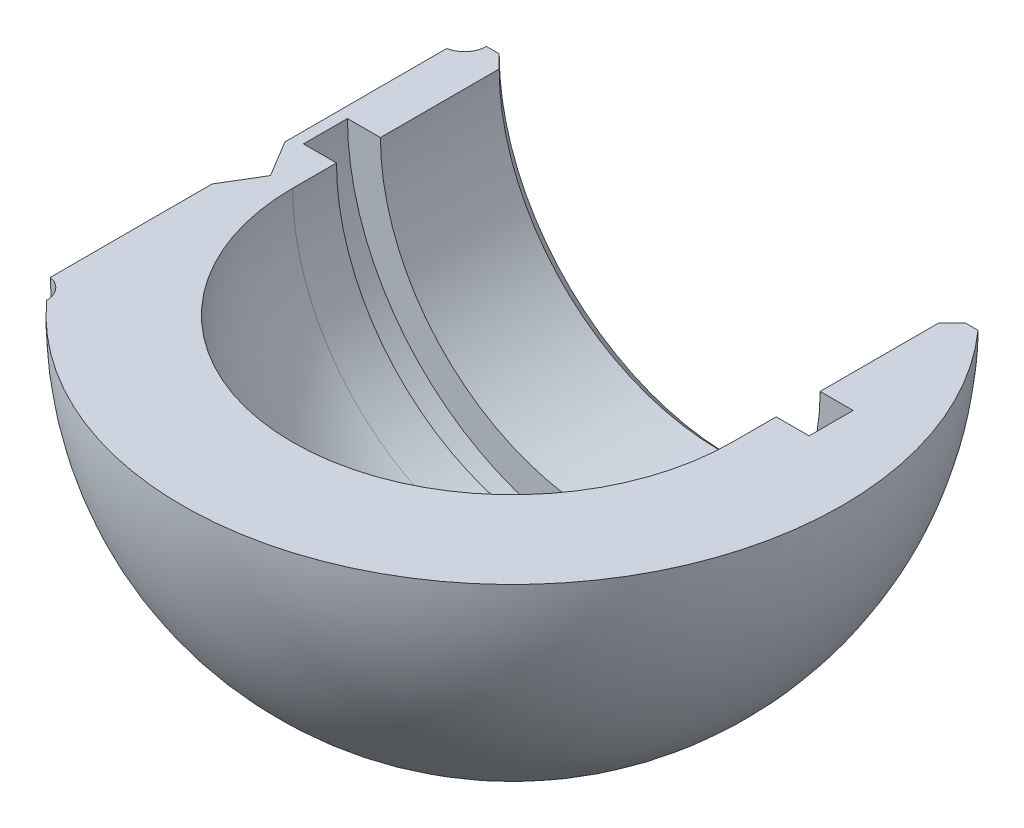
ISO-10303-21;
HEADER;
FILE_DESCRIPTION(('STEP AP214'),'2;1');
FILE_NAME('part.step','',(''),(''),'','','');
FILE_SCHEMA(('AUTOMOTIVE_DESIGN { 1 0 10303 214 1 1 1 1 }'));
ENDSEC;
DATA;
#1=APPLICATION_CONTEXT('core data for automotive mechanical design processes');
#2=APPLICATION_PROTOCOL_DEFINITION('international standard','automotive_design',2000,#1);
#3=PRODUCT_CONTEXT('',#1,'mechanical');
#4=PRODUCT('Part','Part','',(#3));
#5=PRODUCT_RELATED_PRODUCT_CATEGORY('part','',(#4));
#6=PRODUCT_DEFINITION_FORMATION('','',#4);
#7=PRODUCT_DEFINITION_CONTEXT('part definition',#1,'design');
#8=PRODUCT_DEFINITION('design','',#6,#7);
#9=PRODUCT_DEFINITION_SHAPE('','',#8);
#10=(LENGTH_UNIT() NAMED_UNIT(*) SI_UNIT(.MILLI.,.METRE.));
#11=(NAMED_UNIT(*) PLANE_ANGLE_UNIT() SI_UNIT($,.RADIAN.));
#12=(NAMED_UNIT(*) SI_UNIT($,.STERADIAN.) SOLID_ANGLE_UNIT());
#13=UNCERTAINTY_MEASURE_WITH_UNIT(LENGTH_MEASURE(1.E-05),#10,'distance_accuracy_value','');
#14=(GEOMETRIC_REPRESENTATION_CONTEXT(3) GLOBAL_UNCERTAINTY_ASSIGNED_CONTEXT((#13)) GLOBAL_UNIT_ASSIGNED_CONTEXT((#10,
#11,#12)) REPRESENTATION_CONTEXT('',''));
#15=CARTESIAN_POINT('',(0.,0.,0.));
#16=DIRECTION('',(0.,0.,1.));
#17=DIRECTION('',(1.,0.,0.));
#18=AXIS2_PLACEMENT_3D('',#15,#16,#17);
#19=CARTESIAN_POINT('',(18.,0.,0.));
#20=DIRECTION('',(-1.,0.,0.));
#21=DIRECTION('',(0.,1.,0.));
#22=AXIS2_PLACEMENT_3D('',#19,#20,#21);
#23=SPHERICAL_SURFACE('',#22,5.);
#24=CARTESIAN_POINT('',(18.,0.,0.));
#25=DIRECTION('',(0.,0.,1.));
#26=DIRECTION('',(-1.,0.,0.));
#27=AXIS2_PLACEMENT_3D('',#24,#25,#26);
#28=CIRCLE('',#27,5.);
#29=CARTESIAN_POINT('',(13.,0.,0.));
#30=VERTEX_POINT('',#29);
#31=CARTESIAN_POINT('',(23.,0.,0.));
#32=VERTEX_POINT('',#31);
#33=EDGE_CURVE('E235',#30,#32,#28,.T.);
#34=ORIENTED_EDGE('',*,*,#33,.F.);
#35=CARTESIAN_POINT('',(18.,0.,0.));
#36=DIRECTION('',(0.,-1.,0.));
#37=DIRECTION('',(1.,0.,0.));
#38=AXIS2_PLACEMENT_3D('',#35,#36,#37);
#39=CIRCLE('',#38,5.);
#40=EDGE_CURVE('E290',#30,#32,#39,.F.);
#41=ORIENTED_EDGE('',*,*,#40,.T.);
#42=EDGE_LOOP('',(#34,#41));
#43=FACE_BOUND('',#42,.T.);
#44=ADVANCED_FACE('F69',(#43),#23,.F.);
#45=CARTESIAN_POINT('',(18.,0.,-7.669133433403));
#46=DIRECTION('',(0.,0.,1.));
#47=DIRECTION('',(1.,0.,0.));
#48=AXIS2_PLACEMENT_3D('',#45,#46,#47);
#49=CYLINDRICAL_SURFACE('',#48,5.);
#50=DIRECTION('',(0.,0.,1.));
#51=VECTOR('',#50,1.);
#52=CARTESIAN_POINT('',(23.,0.,-7.669133433403));
#53=LINE('',#52,#51);
#54=CARTESIAN_POINT('',(23.,0.,-2.));
#55=VERTEX_POINT('',#54);
#56=CARTESIAN_POINT('',(23.,0.,-4.7));
#57=VERTEX_POINT('',#56);
#58=EDGE_CURVE('E196',#55,#57,#53,.F.);
#59=ORIENTED_EDGE('',*,*,#58,.T.);
#60=CARTESIAN_POINT('',(18.,0.,-4.7));
#61=DIRECTION('',(0.,0.,1.));
#62=DIRECTION('',(1.,0.,0.));
#63=AXIS2_PLACEMENT_3D('',#60,#61,#62);
#64=CIRCLE('',#63,5.);
#65=CARTESIAN_POINT('',(13.,0.,-4.7));
#66=VERTEX_POINT('',#65);
#67=EDGE_CURVE('E194',#57,#66,#64,.F.);
#68=ORIENTED_EDGE('',*,*,#67,.T.);
#69=CARTESIAN_POINT('',(13.,0.,-5.));
#70=CARTESIAN_POINT('',(13.,0.,-2.));
#71=(BOUNDED_CURVE() B_SPLINE_CURVE(1,(#69,#70),.UNSPECIFIED.,.F.,
.F.) B_SPLINE_CURVE_WITH_KNOTS((2,2),(2.669133433403,5.669133433403),
.UNSPECIFIED.) CURVE() GEOMETRIC_REPRESENTATION_ITEM() RATIONAL_B_SPLINE_CURVE((1.,1.)) REPRESENTATION_ITEM(''));
#72=CARTESIAN_POINT('',(13.,0.,-4.5081978230586));
#73=VERTEX_POINT('',#72);
#74=EDGE_CURVE('E222',#66,#73,#71,.T.);
#75=ORIENTED_EDGE('',*,*,#74,.T.);
#76=DIRECTION('',(0.,0.,1.));
#77=VECTOR('',#76,1.);
#78=CARTESIAN_POINT('',(13.,0.,-7.669133433403));
#79=LINE('',#78,#77);
#80=CARTESIAN_POINT('',(13.,0.,-2.));
#81=VERTEX_POINT('',#80);
#82=EDGE_CURVE('E306',#73,#81,#79,.T.);
#83=ORIENTED_EDGE('',*,*,#82,.T.);
#84=CARTESIAN_POINT('',(18.,0.,-2.));
#85=DIRECTION('',(0.,0.,1.));
#86=DIRECTION('',(1.,0.,0.));
#87=AXIS2_PLACEMENT_3D('',#84,#85,#86);
#88=CIRCLE('',#87,5.);
#89=EDGE_CURVE('E210',#81,#55,#88,.T.);
#90=ORIENTED_EDGE('',*,*,#89,.T.);
#91=EDGE_LOOP('',(#59,#68,#75,#83,#90));
#92=FACE_BOUND('',#91,.T.);
#93=ADVANCED_FACE('F205',(#92),#49,.F.);
#94=CARTESIAN_POINT('',(18.,0.,0.));
#95=DIRECTION('',(-1.,0.,0.));
#96=DIRECTION('',(0.,1.,0.));
#97=AXIS2_PLACEMENT_3D('',#94,#95,#96);
#98=SPHERICAL_SURFACE('',#97,7.5);
#99=CARTESIAN_POINT('',(18.,0.,-5.));
#100=DIRECTION('',(0.,0.,1.));
#101=DIRECTION('',(0.,-1.,0.));
#102=AXIS2_PLACEMENT_3D('',#99,#100,#101);
#103=CIRCLE('',#102,5.590169943749);
#104=CARTESIAN_POINT('',(12.409830056251,0.,-5.00000000000001));
#105=VERTEX_POINT('',#104);
#106=CARTESIAN_POINT('',(23.590169943749,0.,-5.));
#107=VERTEX_POINT('',#106);
#108=EDGE_CURVE('E227',#105,#107,#103,.T.);
#109=ORIENTED_EDGE('',*,*,#108,.T.);
#110=CARTESIAN_POINT('',(18.,0.,0.));
#111=DIRECTION('',(0.,-1.,0.));
#112=DIRECTION('',(1.,0.,0.));
#113=AXIS2_PLACEMENT_3D('',#110,#111,#112);
#114=CIRCLE('',#113,7.5);
#115=CARTESIAN_POINT('',(12.409830056251,0.,5.00000000000027));
#116=VERTEX_POINT('',#115);
#117=EDGE_CURVE('E12',#116,#107,#114,.F.);
#118=ORIENTED_EDGE('',*,*,#117,.F.);
#119=CARTESIAN_POINT('',(12.409830056251,0.,0.));
#120=DIRECTION('',(1.,0.,0.));
#121=DIRECTION('',(0.,0.,1.));
#122=AXIS2_PLACEMENT_3D('',#119,#120,#121);
#123=CIRCLE('',#122,5.);
#124=EDGE_CURVE('E174',#116,#105,#123,.T.);
#125=ORIENTED_EDGE('',*,*,#124,.T.);
#126=EDGE_LOOP('',(#109,#118,#125));
#127=FACE_BOUND('',#126,.T.);
#128=ADVANCED_FACE('F331',(#127),#98,.T.);
#129=CARTESIAN_POINT('',(18.,0.,-5.));
#130=DIRECTION('',(0.,0.,-1.));
#131=DIRECTION('',(-1.,0.,0.));
#132=AXIS2_PLACEMENT_3D('',#129,#130,#131);
#133=CONICAL_SURFACE('',#132,5.3,0.785398163397451);
#134=ORIENTED_EDGE('',*,*,#67,.F.);
#135=DIRECTION('',(-0.707106781186549,0.,0.707106781186546));
#136=VECTOR('',#135,1.);
#137=CARTESIAN_POINT('',(18.,0.,0.29999999999997));
#138=LINE('',#137,#136);
#139=CARTESIAN_POINT('',(23.3,0.,-5.));
#140=VERTEX_POINT('',#139);
#141=EDGE_CURVE('E78',#140,#57,#138,.T.);
#142=ORIENTED_EDGE('',*,*,#141,.F.);
#143=CARTESIAN_POINT('',(18.,0.,-5.));
#144=DIRECTION('',(0.,0.,1.));
#145=DIRECTION('',(1.,0.,0.));
#146=AXIS2_PLACEMENT_3D('',#143,#144,#145);
#147=CIRCLE('',#146,5.30000000000001);
#148=CARTESIAN_POINT('',(12.7,0.,-5.00000000000001));
#149=VERTEX_POINT('',#148);
#150=EDGE_CURVE('E214',#149,#140,#147,.T.);
#151=ORIENTED_EDGE('',*,*,#150,.F.);
#152=DIRECTION('',(-0.70710678118655,0.,-0.707106781186546));
#153=VECTOR('',#152,1.);
#154=CARTESIAN_POINT('',(13.,0.,-4.7));
#155=LINE('',#154,#153);
#156=EDGE_CURVE('E189',#66,#149,#155,.T.);
#157=ORIENTED_EDGE('',*,*,#156,.F.);
#158=EDGE_LOOP('',(#134,#142,#151,#157));
#159=FACE_BOUND('',#158,.T.);
#160=ADVANCED_FACE('F72',(#159),#133,.F.);
#161=CARTESIAN_POINT('',(11.909830056251,0.,0.));
#162=DIRECTION('',(1.,0.,0.));
#163=DIRECTION('',(0.,0.,1.));
#164=AXIS2_PLACEMENT_3D('',#161,#162,#163);
#165=TOROIDAL_SURFACE('',#164,5.,0.5);
#166=CARTESIAN_POINT('',(11.909830056251,0.,5.));
#167=DIRECTION('',(0.,-1.,0.));
#168=DIRECTION('',(1.,0.,0.));
#169=AXIS2_PLACEMENT_3D('',#166,#167,#168);
#170=CIRCLE('',#169,0.5);
#171=CARTESIAN_POINT('',(12.,0.,4.5081978230586));
#172=VERTEX_POINT('',#171);
#173=EDGE_CURVE('E167',#116,#172,#170,.F.);
#174=ORIENTED_EDGE('',*,*,#173,.T.);
#175=CARTESIAN_POINT('',(12.,0.,0.));
#176=DIRECTION('',(1.,0.,0.));
#177=DIRECTION('',(0.,1.,0.));
#178=AXIS2_PLACEMENT_3D('',#175,#176,#177);
#179=CIRCLE('',#178,4.5081978230586);
#180=CARTESIAN_POINT('',(12.,0.,-4.5081978230586));
#181=VERTEX_POINT('',#180);
#182=EDGE_CURVE('E172',#181,#172,#179,.F.);
#183=ORIENTED_EDGE('',*,*,#182,.F.);
#184=CARTESIAN_POINT('',(12.409830056251,0.,-5.));
#185=CARTESIAN_POINT('',(12.409830056251,0.,-4.775600524744));
#186=CARTESIAN_POINT('',(12.292308199912,0.,-4.551397520363));
#187=CARTESIAN_POINT('',(12.05751792537,0.,-4.399767710542));
#188=CARTESIAN_POINT('',(11.762142187131,0.,-4.399767710542));
#189=CARTESIAN_POINT('',(11.527351912589,0.,-4.551397520363));
#190=CARTESIAN_POINT('',(11.40983005625,0.,-4.775600524744));
#191=CARTESIAN_POINT('',(11.409830056251,0.,-5.));
#192=(BOUNDED_CURVE() B_SPLINE_CURVE(7,(#184,#185,#186,#187,#188,#189,#190,#191),.UNSPECIFIED.,
.F.,.F.) B_SPLINE_CURVE_WITH_KNOTS((8,8),(1.570796326795,4.712388980385),
.UNSPECIFIED.) CURVE() GEOMETRIC_REPRESENTATION_ITEM() RATIONAL_B_SPLINE_CURVE((1.,1.,1.,1.,1.,
1.,1.,1.)) REPRESENTATION_ITEM(''));
#193=EDGE_CURVE('E221',#105,#181,#192,.T.);
#194=ORIENTED_EDGE('',*,*,#193,.F.);
#195=ORIENTED_EDGE('',*,*,#124,.F.);
#196=EDGE_LOOP('',(#174,#183,#194,#195));
#197=FACE_BOUND('',#196,.T.);
#198=ADVANCED_FACE('F169',(#197),#165,.F.);
#199=CARTESIAN_POINT('',(18.,0.,-7.669133433403));
#200=DIRECTION('',(0.,0.,1.));
#201=DIRECTION('',(1.,0.,0.));
#202=AXIS2_PLACEMENT_3D('',#199,#200,#201);
#203=CYLINDRICAL_SURFACE('',#202,5.);
#204=CARTESIAN_POINT('',(18.,0.,-1.));
#205=DIRECTION('',(0.,0.,-1.));
#206=DIRECTION('',(1.,0.,0.));
#207=AXIS2_PLACEMENT_3D('',#204,#205,#206);
#208=CIRCLE('',#207,5.);
#209=CARTESIAN_POINT('',(23.,0.,-0.999999999999999));
#210=VERTEX_POINT('',#209);
#211=CARTESIAN_POINT('',(13.,0.,-1.));
#212=VERTEX_POINT('',#211);
#213=EDGE_CURVE('E280',#210,#212,#208,.T.);
#214=ORIENTED_EDGE('',*,*,#213,.T.);
#215=DIRECTION('',(0.,0.,1.));
#216=VECTOR('',#215,1.);
#217=CARTESIAN_POINT('',(13.,0.,-7.669133433403));
#218=LINE('',#217,#216);
#219=EDGE_CURVE('E212',#212,#30,#218,.T.);
#220=ORIENTED_EDGE('',*,*,#219,.T.);
#221=ORIENTED_EDGE('',*,*,#33,.T.);
#222=CARTESIAN_POINT('',(23.,0.,-1.));
#223=CARTESIAN_POINT('',(23.,0.,0.));
#224=(BOUNDED_CURVE() B_SPLINE_CURVE(1,(#222,#223),.UNSPECIFIED.,.F.,
.F.) B_SPLINE_CURVE_WITH_KNOTS((2,2),(6.669133433403,7.669133433403),
.UNSPECIFIED.) CURVE() GEOMETRIC_REPRESENTATION_ITEM() RATIONAL_B_SPLINE_CURVE((1.,1.)) REPRESENTATION_ITEM(''));
#225=EDGE_CURVE('E215',#210,#32,#224,.T.);
#226=ORIENTED_EDGE('',*,*,#225,.F.);
#227=EDGE_LOOP('',(#214,#220,#221,#226));
#228=FACE_BOUND('',#227,.T.);
#229=ADVANCED_FACE('F323',(#228),#203,.F.);
#230=CARTESIAN_POINT('',(22.75,0.,-1.));
#231=DIRECTION('',(0.,0.,1.));
#232=DIRECTION('',(1.,0.,0.));
#233=AXIS2_PLACEMENT_3D('',#230,#231,#232);
#234=PLANE('',#233);
#235=CARTESIAN_POINT('',(18.,0.,-1.));
#236=DIRECTION('',(0.,0.,1.));
#237=DIRECTION('',(-1.,0.,0.));
#238=AXIS2_PLACEMENT_3D('',#235,#236,#237);
#239=CIRCLE('',#238,5.75);
#240=CARTESIAN_POINT('',(12.25,0.,-1.));
#241=VERTEX_POINT('',#240);
#242=CARTESIAN_POINT('',(23.75,0.,-1.));
#243=VERTEX_POINT('',#242);
#244=EDGE_CURVE('E271',#241,#243,#239,.T.);
#245=ORIENTED_EDGE('',*,*,#244,.F.);
#246=DIRECTION('',(1.,0.,0.));
#247=VECTOR('',#246,1.);
#248=CARTESIAN_POINT('',(22.75,0.,-1.));
#249=LINE('',#248,#247);
#250=EDGE_CURVE('E297',#241,#212,#249,.T.);
#251=ORIENTED_EDGE('',*,*,#250,.T.);
#252=ORIENTED_EDGE('',*,*,#213,.F.);
#253=EDGE_CURVE('E294',#210,#243,#249,.T.);
#254=ORIENTED_EDGE('',*,*,#253,.T.);
#255=EDGE_LOOP('',(#245,#251,#252,#254));
#256=FACE_BOUND('',#255,.T.);
#257=ADVANCED_FACE('F317',(#256),#234,.F.);
#258=CARTESIAN_POINT('',(18.,0.,-1.5));
#259=DIRECTION('',(0.,0.,1.));
#260=DIRECTION('',(1.,0.,0.));
#261=AXIS2_PLACEMENT_3D('',#258,#259,#260);
#262=CYLINDRICAL_SURFACE('',#261,5.75);
#263=CARTESIAN_POINT('',(18.,0.,-2.));
#264=DIRECTION('',(0.,0.,1.));
#265=DIRECTION('',(-1.,0.,0.));
#266=AXIS2_PLACEMENT_3D('',#263,#264,#265);
#267=CIRCLE('',#266,5.75);
#268=CARTESIAN_POINT('',(12.25,0.,-2.));
#269=VERTEX_POINT('',#268);
#270=CARTESIAN_POINT('',(23.75,0.,-2.));
#271=VERTEX_POINT('',#270);
#272=EDGE_CURVE('E245',#269,#271,#267,.T.);
#273=ORIENTED_EDGE('',*,*,#272,.F.);
#274=DIRECTION('',(0.,0.,1.));
#275=VECTOR('',#274,1.);
#276=CARTESIAN_POINT('',(12.25,0.,-1.5));
#277=LINE('',#276,#275);
#278=EDGE_CURVE('E300',#269,#241,#277,.T.);
#279=ORIENTED_EDGE('',*,*,#278,.T.);
#280=ORIENTED_EDGE('',*,*,#244,.T.);
#281=CARTESIAN_POINT('',(23.75,0.,-1.5));
#282=CARTESIAN_POINT('',(23.75,0.,-1.));
#283=(BOUNDED_CURVE() B_SPLINE_CURVE(1,(#281,#282),.UNSPECIFIED.,.F.,
.F.) B_SPLINE_CURVE_WITH_KNOTS((2,2),(0.,0.5),
.UNSPECIFIED.) CURVE() GEOMETRIC_REPRESENTATION_ITEM() RATIONAL_B_SPLINE_CURVE((1.,1.)) REPRESENTATION_ITEM(''));
#284=CARTESIAN_POINT('',(23.75,0.,-1.5));
#285=VERTEX_POINT('',#284);
#286=EDGE_CURVE('E236',#285,#243,#283,.T.);
#287=ORIENTED_EDGE('',*,*,#286,.F.);
#288=CARTESIAN_POINT('',(23.75,0.,-2.));
#289=CARTESIAN_POINT('',(23.75,0.,-1.5));
#290=(BOUNDED_CURVE() B_SPLINE_CURVE(1,(#288,#289),.UNSPECIFIED.,.F.,
.F.) B_SPLINE_CURVE_WITH_KNOTS((2,2),(-0.5,0.),
.UNSPECIFIED.) CURVE() GEOMETRIC_REPRESENTATION_ITEM() RATIONAL_B_SPLINE_CURVE((1.,1.)) REPRESENTATION_ITEM(''));
#291=EDGE_CURVE('E244',#271,#285,#290,.T.);
#292=ORIENTED_EDGE('',*,*,#291,.F.);
#293=EDGE_LOOP('',(#273,#279,#280,#287,#292));
#294=FACE_BOUND('',#293,.T.);
#295=ADVANCED_FACE('F321',(#294),#262,.F.);
#296=CARTESIAN_POINT('',(23.75,0.,-2.));
#297=DIRECTION('',(0.,0.,-1.));
#298=DIRECTION('',(0.,-1.,0.));
#299=AXIS2_PLACEMENT_3D('',#296,#297,#298);
#300=PLANE('',#299);
#301=ORIENTED_EDGE('',*,*,#272,.T.);
#302=DIRECTION('',(-1.,0.,0.));
#303=VECTOR('',#302,1.);
#304=CARTESIAN_POINT('',(23.75,0.,-2.));
#305=LINE('',#304,#303);
#306=EDGE_CURVE('E211',#271,#55,#305,.T.);
#307=ORIENTED_EDGE('',*,*,#306,.T.);
#308=ORIENTED_EDGE('',*,*,#89,.F.);
#309=EDGE_CURVE('E303',#81,#269,#305,.T.);
#310=ORIENTED_EDGE('',*,*,#309,.T.);
#311=EDGE_LOOP('',(#301,#307,#308,#310));
#312=FACE_BOUND('',#311,.T.);
#313=ADVANCED_FACE('F310',(#312),#300,.F.);
#314=CARTESIAN_POINT('',(24.080144160626,0.,-5.));
#315=DIRECTION('',(0.,0.,1.));
#316=DIRECTION('',(1.,0.,0.));
#317=AXIS2_PLACEMENT_3D('',#314,#315,#316);
#318=PLANE('',#317);
#319=ORIENTED_EDGE('',*,*,#108,.F.);
#320=DIRECTION('',(1.,0.,0.));
#321=VECTOR('',#320,1.);
#322=CARTESIAN_POINT('',(24.080144160626,0.,-5.));
#323=LINE('',#322,#321);
#324=EDGE_CURVE('E176',#105,#149,#323,.T.);
#325=ORIENTED_EDGE('',*,*,#324,.T.);
#326=ORIENTED_EDGE('',*,*,#150,.T.);
#327=EDGE_CURVE('E84',#140,#107,#323,.T.);
#328=ORIENTED_EDGE('',*,*,#327,.T.);
#329=EDGE_LOOP('',(#319,#325,#326,#328));
#330=FACE_BOUND('',#329,.T.);
#331=ADVANCED_FACE('F347',(#330),#318,.F.);
#332=CARTESIAN_POINT('',(12.,0.,0.));
#333=DIRECTION('',(-1.,0.,0.));
#334=DIRECTION('',(0.,-1.,0.));
#335=AXIS2_PLACEMENT_3D('',#332,#333,#334);
#336=PLANE('',#335);
#337=DIRECTION('',(0.,0.,1.));
#338=VECTOR('',#337,1.);
#339=CARTESIAN_POINT('',(12.,0.,0.));
#340=LINE('',#339,#338);
#341=CARTESIAN_POINT('',(12.0000000000003,0.,-0.828580776467372));
#342=VERTEX_POINT('',#341);
#343=EDGE_CURVE('E91',#181,#342,#340,.T.);
#344=ORIENTED_EDGE('',*,*,#343,.F.);
#345=ORIENTED_EDGE('',*,*,#182,.T.);
#346=CARTESIAN_POINT('',(12.,0.,0.828580776467372));
#347=VERTEX_POINT('',#346);
#348=EDGE_CURVE('E179',#347,#172,#340,.T.);
#349=ORIENTED_EDGE('',*,*,#348,.F.);
#350=CARTESIAN_POINT('',(12.,0.,0.));
#351=DIRECTION('',(-1.,0.,0.));
#352=DIRECTION('',(0.,-1.,0.));
#353=AXIS2_PLACEMENT_3D('',#350,#351,#352);
#354=CIRCLE('',#353,0.828580776467372);
#355=EDGE_CURVE('E187',#347,#342,#354,.F.);
#356=ORIENTED_EDGE('',*,*,#355,.T.);
#357=EDGE_LOOP('',(#344,#345,#349,#356));
#358=FACE_BOUND('',#357,.T.);
#359=ADVANCED_FACE('F186',(#358),#336,.T.);
#360=CARTESIAN_POINT('',(11.498930779133,0.,0.));
#361=DIRECTION('',(-1.,0.,0.));
#362=DIRECTION('',(0.,0.,-1.));
#363=AXIS2_PLACEMENT_3D('',#360,#361,#362);
#364=CONICAL_SURFACE('',#363,1.6625,1.02974425868);
#365=ORIENTED_EDGE('',*,*,#355,.F.);
#366=DIRECTION('',(-0.515038074907186,0.,0.857167300703836));
#367=VECTOR('',#366,1.);
#368=CARTESIAN_POINT('',(12.4978615582587,0.,0.));
#369=LINE('',#368,#367);
#370=CARTESIAN_POINT('',(12.4978615582587,0.,0.));
#371=VERTEX_POINT('',#370);
#372=EDGE_CURVE('E182',#347,#371,#369,.F.);
#373=ORIENTED_EDGE('',*,*,#372,.T.);
#374=CARTESIAN_POINT('',(12.497861558259,0.,0.));
#375=CARTESIAN_POINT('',(10.500000000006,0.,-3.325000000003));
#376=(BOUNDED_CURVE() B_SPLINE_CURVE(1,(#374,#375),.UNSPECIFIED.,.F.,
.F.) B_SPLINE_CURVE_WITH_KNOTS((2,2),(-1.939528022867,1.93952802287),
.UNSPECIFIED.) CURVE() GEOMETRIC_REPRESENTATION_ITEM() RATIONAL_B_SPLINE_CURVE((1.,1.)) REPRESENTATION_ITEM(''));
#377=EDGE_CURVE('E220',#371,#342,#376,.T.);
#378=ORIENTED_EDGE('',*,*,#377,.T.);
#379=EDGE_LOOP('',(#365,#373,#378));
#380=FACE_BOUND('',#379,.T.);
#381=ADVANCED_FACE('F349',(#380),#364,.F.);
#382=CARTESIAN_POINT('',(25.5,0.,0.));
#383=DIRECTION('',(0.,-1.,0.));
#384=DIRECTION('',(1.,0.,0.));
#385=AXIS2_PLACEMENT_3D('',#382,#383,#384);
#386=PLANE('',#385);
#387=ORIENTED_EDGE('',*,*,#40,.F.);
#388=ORIENTED_EDGE('',*,*,#219,.F.);
#389=ORIENTED_EDGE('',*,*,#250,.F.);
#390=ORIENTED_EDGE('',*,*,#278,.F.);
#391=ORIENTED_EDGE('',*,*,#309,.F.);
#392=ORIENTED_EDGE('',*,*,#82,.F.);
#393=ORIENTED_EDGE('',*,*,#74,.F.);
#394=ORIENTED_EDGE('',*,*,#156,.T.);
#395=ORIENTED_EDGE('',*,*,#324,.F.);
#396=ORIENTED_EDGE('',*,*,#193,.T.);
#397=ORIENTED_EDGE('',*,*,#343,.T.);
#398=ORIENTED_EDGE('',*,*,#377,.F.);
#399=ORIENTED_EDGE('',*,*,#372,.F.);
#400=ORIENTED_EDGE('',*,*,#348,.T.);
#401=ORIENTED_EDGE('',*,*,#173,.F.);
#402=ORIENTED_EDGE('',*,*,#117,.T.);
#403=ORIENTED_EDGE('',*,*,#327,.F.);
#404=ORIENTED_EDGE('',*,*,#141,.T.);
#405=ORIENTED_EDGE('',*,*,#58,.F.);
#406=ORIENTED_EDGE('',*,*,#306,.F.);
#407=ORIENTED_EDGE('',*,*,#291,.T.);
#408=ORIENTED_EDGE('',*,*,#286,.T.);
#409=ORIENTED_EDGE('',*,*,#253,.F.);
#410=ORIENTED_EDGE('',*,*,#225,.T.);
#411=EDGE_LOOP('',(#387,#388,#389,#390,#391,#392,#393,#394,#395,#396,#397,#398,#399,#400,#401,
#402,#403,#404,#405,#406,#407,#408,#409,#410));
#412=FACE_BOUND('',#411,.T.);
#413=ADVANCED_FACE('F180',(#412),#386,.F.);
#414=CLOSED_SHELL('',(#44,#93,#128,#160,#198,#229,#257,#295,#313,#331,#359,#381,#413));
#415=MANIFOLD_SOLID_BREP('B2',#414);
#416=ADVANCED_BREP_SHAPE_REPRESENTATION('',(#18,#415),#14);
#417=SHAPE_DEFINITION_REPRESENTATION(#9,#416);
ENDSEC;
END-ISO-10303-21;
